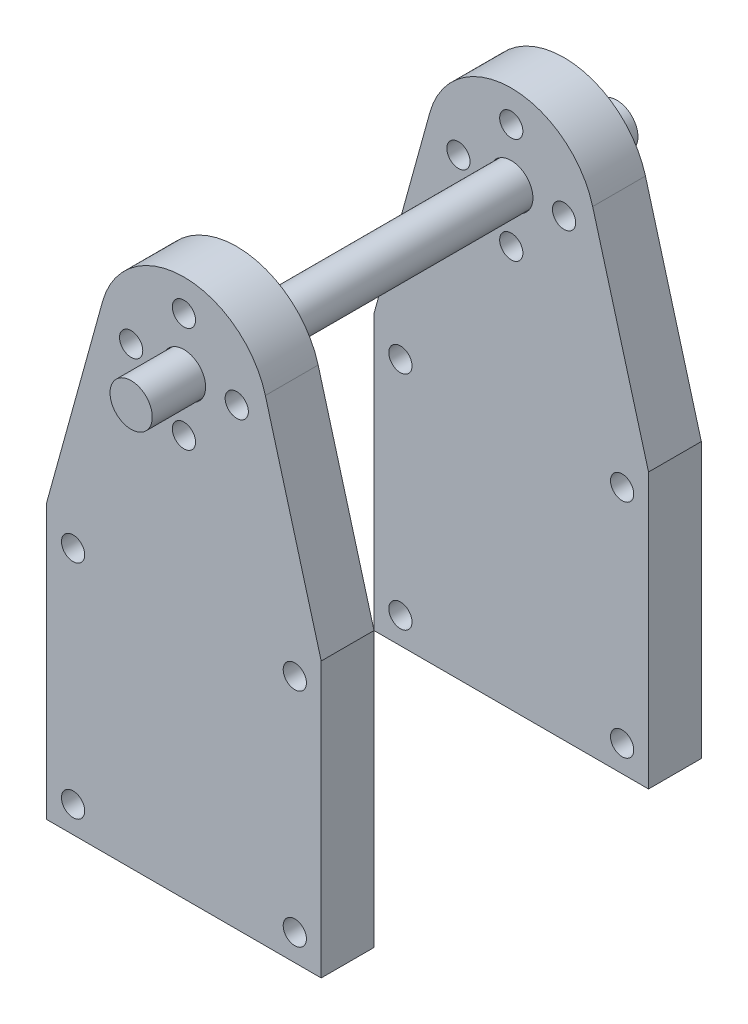
ISO-10303-21;
HEADER;
FILE_DESCRIPTION(('STEP AP214'),'2;1');
FILE_NAME('part.step','',(''),(''),'','','');
FILE_SCHEMA(('AUTOMOTIVE_DESIGN { 1 0 10303 214 1 1 1 1 }'));
ENDSEC;
DATA;
#1=APPLICATION_CONTEXT('core data for automotive mechanical design processes');
#2=APPLICATION_PROTOCOL_DEFINITION('international standard','automotive_design',2000,#1);
#3=PRODUCT_CONTEXT('',#1,'mechanical');
#4=PRODUCT('Part','Part','',(#3));
#5=PRODUCT_RELATED_PRODUCT_CATEGORY('part','',(#4));
#6=PRODUCT_DEFINITION_FORMATION('','',#4);
#7=PRODUCT_DEFINITION_CONTEXT('part definition',#1,'design');
#8=PRODUCT_DEFINITION('design','',#6,#7);
#9=PRODUCT_DEFINITION_SHAPE('','',#8);
#10=(LENGTH_UNIT() NAMED_UNIT(*) SI_UNIT(.MILLI.,.METRE.));
#11=(NAMED_UNIT(*) PLANE_ANGLE_UNIT() SI_UNIT($,.RADIAN.));
#12=(NAMED_UNIT(*) SI_UNIT($,.STERADIAN.) SOLID_ANGLE_UNIT());
#13=UNCERTAINTY_MEASURE_WITH_UNIT(LENGTH_MEASURE(1.E-05),#10,'distance_accuracy_value','');
#14=(GEOMETRIC_REPRESENTATION_CONTEXT(3) GLOBAL_UNCERTAINTY_ASSIGNED_CONTEXT((#13)) GLOBAL_UNIT_ASSIGNED_CONTEXT((#10,
#11,#12)) REPRESENTATION_CONTEXT('',''));
#15=CARTESIAN_POINT('',(0.,0.,0.));
#16=DIRECTION('',(0.,0.,1.));
#17=DIRECTION('',(1.,0.,0.));
#18=AXIS2_PLACEMENT_3D('',#15,#16,#17);
#19=CARTESIAN_POINT('',(0.,30.,-36.));
#20=DIRECTION('',(0.,0.,1.));
#21=DIRECTION('',(1.,0.,0.));
#22=AXIS2_PLACEMENT_3D('',#19,#20,#21);
#23=CYLINDRICAL_SURFACE('',#22,2.);
#24=CARTESIAN_POINT('',(0.,30.,-36.));
#25=DIRECTION('',(0.,0.,-1.));
#26=DIRECTION('',(-1.,0.,0.));
#27=AXIS2_PLACEMENT_3D('',#24,#25,#26);
#28=CIRCLE('',#27,2.);
#29=CARTESIAN_POINT('',(-2.,30.,-36.));
#30=VERTEX_POINT('',#29);
#31=EDGE_CURVE('E11',#30,#30,#28,.T.);
#32=ORIENTED_EDGE('',*,*,#31,.F.);
#33=EDGE_LOOP('',(#32));
#34=FACE_BOUND('',#33,.T.);
#35=CARTESIAN_POINT('',(0.,30.,10.));
#36=DIRECTION('',(0.,0.,-1.));
#37=DIRECTION('',(-1.,0.,0.));
#38=AXIS2_PLACEMENT_3D('',#35,#36,#37);
#39=CIRCLE('',#38,2.);
#40=CARTESIAN_POINT('',(-2.,30.,10.));
#41=VERTEX_POINT('',#40);
#42=EDGE_CURVE('E50',#41,#41,#39,.T.);
#43=ORIENTED_EDGE('',*,*,#42,.T.);
#44=EDGE_LOOP('',(#43));
#45=FACE_BOUND('',#44,.T.);
#46=ADVANCED_FACE('F44',(#34,#45),#23,.T.);
#47=CARTESIAN_POINT('',(0.,30.,-36.));
#48=DIRECTION('',(0.,0.,-1.));
#49=DIRECTION('',(-1.,0.,0.));
#50=AXIS2_PLACEMENT_3D('',#47,#48,#49);
#51=PLANE('',#50);
#52=ORIENTED_EDGE('',*,*,#31,.T.);
#53=EDGE_LOOP('',(#52));
#54=FACE_BOUND('',#53,.T.);
#55=ADVANCED_FACE('F59',(#54),#51,.T.);
#56=CARTESIAN_POINT('',(0.,30.,10.));
#57=DIRECTION('',(0.,0.,-1.));
#58=DIRECTION('',(-1.,0.,0.));
#59=AXIS2_PLACEMENT_3D('',#56,#57,#58);
#60=PLANE('',#59);
#61=ORIENTED_EDGE('',*,*,#42,.F.);
#62=EDGE_LOOP('',(#61));
#63=FACE_BOUND('',#62,.T.);
#64=ADVANCED_FACE('F57',(#63),#60,.F.);
#65=CLOSED_SHELL('',(#46,#55,#64));
#66=MANIFOLD_SOLID_BREP('B2',#65);
#67=CARTESIAN_POINT('',(-13.,-13.,-31.));
#68=DIRECTION('',(0.,-1.,0.));
#69=DIRECTION('',(0.,0.,-1.));
#70=AXIS2_PLACEMENT_3D('',#67,#68,#69);
#71=PLANE('',#70);
#72=DIRECTION('',(1.,0.,0.));
#73=VECTOR('',#72,1.);
#74=CARTESIAN_POINT('',(-13.,-13.,-26.));
#75=LINE('',#74,#73);
#76=CARTESIAN_POINT('',(-13.,-13.,-26.));
#77=VERTEX_POINT('',#76);
#78=CARTESIAN_POINT('',(13.,-13.,-26.));
#79=VERTEX_POINT('',#78);
#80=EDGE_CURVE('E179',#77,#79,#75,.T.);
#81=ORIENTED_EDGE('',*,*,#80,.F.);
#82=DIRECTION('',(0.,0.,1.));
#83=VECTOR('',#82,1.);
#84=CARTESIAN_POINT('',(-13.,-13.,-31.));
#85=LINE('',#84,#83);
#86=CARTESIAN_POINT('',(-13.,-13.,-31.));
#87=VERTEX_POINT('',#86);
#88=EDGE_CURVE('E42',#87,#77,#85,.T.);
#89=ORIENTED_EDGE('',*,*,#88,.F.);
#90=DIRECTION('',(1.,0.,0.));
#91=VECTOR('',#90,1.);
#92=CARTESIAN_POINT('',(-13.,-13.,-31.));
#93=LINE('',#92,#91);
#94=CARTESIAN_POINT('',(13.,-13.,-31.));
#95=VERTEX_POINT('',#94);
#96=EDGE_CURVE('E194',#87,#95,#93,.T.);
#97=ORIENTED_EDGE('',*,*,#96,.T.);
#98=DIRECTION('',(0.,0.,1.));
#99=VECTOR('',#98,1.);
#100=CARTESIAN_POINT('',(13.,-13.,-31.));
#101=LINE('',#100,#99);
#102=EDGE_CURVE('E97',#95,#79,#101,.T.);
#103=ORIENTED_EDGE('',*,*,#102,.T.);
#104=EDGE_LOOP('',(#81,#89,#97,#103));
#105=FACE_BOUND('',#104,.T.);
#106=ADVANCED_FACE('F94',(#105),#71,.T.);
#107=CARTESIAN_POINT('',(-13.,13.,-31.));
#108=DIRECTION('',(-1.,0.,0.));
#109=DIRECTION('',(0.,0.,1.));
#110=AXIS2_PLACEMENT_3D('',#107,#108,#109);
#111=PLANE('',#110);
#112=DIRECTION('',(0.,-1.,0.));
#113=VECTOR('',#112,1.);
#114=CARTESIAN_POINT('',(-13.,13.,-26.));
#115=LINE('',#114,#113);
#116=CARTESIAN_POINT('',(-13.,13.,-26.));
#117=VERTEX_POINT('',#116);
#118=EDGE_CURVE('E192',#117,#77,#115,.T.);
#119=ORIENTED_EDGE('',*,*,#118,.F.);
#120=DIRECTION('',(0.,0.,1.));
#121=VECTOR('',#120,1.);
#122=CARTESIAN_POINT('',(-13.,13.,-31.));
#123=LINE('',#122,#121);
#124=CARTESIAN_POINT('',(-13.,13.,-31.));
#125=VERTEX_POINT('',#124);
#126=EDGE_CURVE('E103',#125,#117,#123,.T.);
#127=ORIENTED_EDGE('',*,*,#126,.F.);
#128=DIRECTION('',(0.,-1.,0.));
#129=VECTOR('',#128,1.);
#130=CARTESIAN_POINT('',(-13.,13.,-31.));
#131=LINE('',#130,#129);
#132=EDGE_CURVE('E169',#125,#87,#131,.T.);
#133=ORIENTED_EDGE('',*,*,#132,.T.);
#134=ORIENTED_EDGE('',*,*,#88,.T.);
#135=EDGE_LOOP('',(#119,#127,#133,#134));
#136=FACE_BOUND('',#135,.T.);
#137=ADVANCED_FACE('F202',(#136),#111,.T.);
#138=CARTESIAN_POINT('',(-7.71074873540169,32.1317490329542,-31.));
#139=DIRECTION('',(-0.963843591925211,0.266468629119279,0.));
#140=DIRECTION('',(-0.266468629119279,-0.963843591925211,0.));
#141=AXIS2_PLACEMENT_3D('',#138,#139,#140);
#142=PLANE('',#141);
#143=DIRECTION('',(-0.266468629119279,-0.963843591925211,0.));
#144=VECTOR('',#143,1.);
#145=CARTESIAN_POINT('',(-7.71074873540169,32.1317490329542,-26.));
#146=LINE('',#145,#144);
#147=CARTESIAN_POINT('',(-7.71074873540169,32.1317490329542,-26.));
#148=VERTEX_POINT('',#147);
#149=EDGE_CURVE('E156',#148,#117,#146,.T.);
#150=ORIENTED_EDGE('',*,*,#149,.F.);
#151=DIRECTION('',(0.,0.,1.));
#152=VECTOR('',#151,1.);
#153=CARTESIAN_POINT('',(-7.71074873540169,32.1317490329542,-31.));
#154=LINE('',#153,#152);
#155=CARTESIAN_POINT('',(-7.71074873540169,32.1317490329542,-31.));
#156=VERTEX_POINT('',#155);
#157=EDGE_CURVE('E151',#156,#148,#154,.T.);
#158=ORIENTED_EDGE('',*,*,#157,.F.);
#159=DIRECTION('',(-0.266468629119279,-0.963843591925211,0.));
#160=VECTOR('',#159,1.);
#161=CARTESIAN_POINT('',(-7.71074873540169,32.1317490329542,-31.));
#162=LINE('',#161,#160);
#163=EDGE_CURVE('E154',#156,#125,#162,.T.);
#164=ORIENTED_EDGE('',*,*,#163,.T.);
#165=ORIENTED_EDGE('',*,*,#126,.T.);
#166=EDGE_LOOP('',(#150,#158,#164,#165));
#167=FACE_BOUND('',#166,.T.);
#168=ADVANCED_FACE('F153',(#167),#142,.T.);
#169=CARTESIAN_POINT('',(0.,30.,-31.));
#170=DIRECTION('',(0.,0.,1.));
#171=DIRECTION('',(1.,0.,0.));
#172=AXIS2_PLACEMENT_3D('',#169,#170,#171);
#173=CYLINDRICAL_SURFACE('',#172,8.);
#174=CARTESIAN_POINT('',(0.,30.,-26.));
#175=DIRECTION('',(0.,0.,1.));
#176=DIRECTION('',(1.,0.,0.));
#177=AXIS2_PLACEMENT_3D('',#174,#175,#176);
#178=CIRCLE('',#177,8.);
#179=CARTESIAN_POINT('',(7.71074873540169,32.1317490329542,-26.));
#180=VERTEX_POINT('',#179);
#181=EDGE_CURVE('E189',#180,#148,#178,.T.);
#182=ORIENTED_EDGE('',*,*,#181,.F.);
#183=DIRECTION('',(0.,0.,1.));
#184=VECTOR('',#183,1.);
#185=CARTESIAN_POINT('',(7.71074873540169,32.1317490329542,-31.));
#186=LINE('',#185,#184);
#187=CARTESIAN_POINT('',(7.71074873540169,32.1317490329542,-31.));
#188=VERTEX_POINT('',#187);
#189=EDGE_CURVE('E161',#188,#180,#186,.T.);
#190=ORIENTED_EDGE('',*,*,#189,.F.);
#191=CARTESIAN_POINT('',(0.,30.,-31.));
#192=DIRECTION('',(0.,0.,1.));
#193=DIRECTION('',(1.,0.,0.));
#194=AXIS2_PLACEMENT_3D('',#191,#192,#193);
#195=CIRCLE('',#194,8.);
#196=EDGE_CURVE('E167',#188,#156,#195,.T.);
#197=ORIENTED_EDGE('',*,*,#196,.T.);
#198=ORIENTED_EDGE('',*,*,#157,.T.);
#199=EDGE_LOOP('',(#182,#190,#197,#198));
#200=FACE_BOUND('',#199,.T.);
#201=ADVANCED_FACE('F171',(#200),#173,.T.);
#202=CARTESIAN_POINT('',(13.,13.,-31.));
#203=DIRECTION('',(0.963843591925211,0.266468629119279,0.));
#204=DIRECTION('',(-0.266468629119279,0.963843591925211,0.));
#205=AXIS2_PLACEMENT_3D('',#202,#203,#204);
#206=PLANE('',#205);
#207=DIRECTION('',(-0.266468629119279,0.963843591925211,0.));
#208=VECTOR('',#207,1.);
#209=CARTESIAN_POINT('',(13.,13.,-26.));
#210=LINE('',#209,#208);
#211=CARTESIAN_POINT('',(13.,13.,-26.));
#212=VERTEX_POINT('',#211);
#213=EDGE_CURVE('E186',#212,#180,#210,.T.);
#214=ORIENTED_EDGE('',*,*,#213,.F.);
#215=DIRECTION('',(0.,0.,1.));
#216=VECTOR('',#215,1.);
#217=CARTESIAN_POINT('',(13.,13.,-31.));
#218=LINE('',#217,#216);
#219=CARTESIAN_POINT('',(13.,13.,-31.));
#220=VERTEX_POINT('',#219);
#221=EDGE_CURVE('E197',#220,#212,#218,.T.);
#222=ORIENTED_EDGE('',*,*,#221,.F.);
#223=DIRECTION('',(-0.266468629119279,0.963843591925211,0.));
#224=VECTOR('',#223,1.);
#225=CARTESIAN_POINT('',(13.,13.,-31.));
#226=LINE('',#225,#224);
#227=EDGE_CURVE('E172',#220,#188,#226,.T.);
#228=ORIENTED_EDGE('',*,*,#227,.T.);
#229=ORIENTED_EDGE('',*,*,#189,.T.);
#230=EDGE_LOOP('',(#214,#222,#228,#229));
#231=FACE_BOUND('',#230,.T.);
#232=ADVANCED_FACE('F215',(#231),#206,.T.);
#233=CARTESIAN_POINT('',(13.,-13.,-31.));
#234=DIRECTION('',(1.,0.,0.));
#235=DIRECTION('',(0.,0.,-1.));
#236=AXIS2_PLACEMENT_3D('',#233,#234,#235);
#237=PLANE('',#236);
#238=DIRECTION('',(0.,1.,0.));
#239=VECTOR('',#238,1.);
#240=CARTESIAN_POINT('',(13.,-13.,-26.));
#241=LINE('',#240,#239);
#242=EDGE_CURVE('E182',#79,#212,#241,.T.);
#243=ORIENTED_EDGE('',*,*,#242,.F.);
#244=ORIENTED_EDGE('',*,*,#102,.F.);
#245=DIRECTION('',(0.,1.,0.));
#246=VECTOR('',#245,1.);
#247=CARTESIAN_POINT('',(13.,-13.,-31.));
#248=LINE('',#247,#246);
#249=EDGE_CURVE('E174',#95,#220,#248,.T.);
#250=ORIENTED_EDGE('',*,*,#249,.T.);
#251=ORIENTED_EDGE('',*,*,#221,.T.);
#252=EDGE_LOOP('',(#243,#244,#250,#251));
#253=FACE_BOUND('',#252,.T.);
#254=ADVANCED_FACE('F199',(#253),#237,.T.);
#255=CARTESIAN_POINT('',(0.,30.,-31.));
#256=DIRECTION('',(0.,0.,1.));
#257=DIRECTION('',(1.,0.,0.));
#258=AXIS2_PLACEMENT_3D('',#255,#256,#257);
#259=PLANE('',#258);
#260=CARTESIAN_POINT('',(-5.,30.,-31.));
#261=DIRECTION('',(0.,0.,1.));
#262=DIRECTION('',(1.,0.,0.));
#263=AXIS2_PLACEMENT_3D('',#260,#261,#262);
#264=CIRCLE('',#263,1.1);
#265=CARTESIAN_POINT('',(-3.9,30.,-31.));
#266=VERTEX_POINT('',#265);
#267=EDGE_CURVE('E269',#266,#266,#264,.T.);
#268=ORIENTED_EDGE('',*,*,#267,.T.);
#269=EDGE_LOOP('',(#268));
#270=FACE_BOUND('',#269,.T.);
#271=CARTESIAN_POINT('',(0.,25.,-31.));
#272=DIRECTION('',(0.,0.,1.));
#273=DIRECTION('',(1.,0.,0.));
#274=AXIS2_PLACEMENT_3D('',#271,#272,#273);
#275=CIRCLE('',#274,1.1);
#276=CARTESIAN_POINT('',(1.1,25.,-31.));
#277=VERTEX_POINT('',#276);
#278=EDGE_CURVE('E277',#277,#277,#275,.T.);
#279=ORIENTED_EDGE('',*,*,#278,.T.);
#280=EDGE_LOOP('',(#279));
#281=FACE_BOUND('',#280,.T.);
#282=CARTESIAN_POINT('',(5.,30.,-31.));
#283=DIRECTION('',(0.,0.,1.));
#284=DIRECTION('',(1.,0.,0.));
#285=AXIS2_PLACEMENT_3D('',#282,#283,#284);
#286=CIRCLE('',#285,1.1);
#287=CARTESIAN_POINT('',(6.1,30.,-31.));
#288=VERTEX_POINT('',#287);
#289=EDGE_CURVE('E283',#288,#288,#286,.T.);
#290=ORIENTED_EDGE('',*,*,#289,.T.);
#291=EDGE_LOOP('',(#290));
#292=FACE_BOUND('',#291,.T.);
#293=CARTESIAN_POINT('',(0.,35.,-31.));
#294=DIRECTION('',(0.,0.,1.));
#295=DIRECTION('',(1.,0.,0.));
#296=AXIS2_PLACEMENT_3D('',#293,#294,#295);
#297=CIRCLE('',#296,1.1);
#298=CARTESIAN_POINT('',(1.1,35.,-31.));
#299=VERTEX_POINT('',#298);
#300=EDGE_CURVE('E289',#299,#299,#297,.T.);
#301=ORIENTED_EDGE('',*,*,#300,.T.);
#302=EDGE_LOOP('',(#301));
#303=FACE_BOUND('',#302,.T.);
#304=CARTESIAN_POINT('',(0.,30.,-31.));
#305=DIRECTION('',(0.,0.,1.));
#306=DIRECTION('',(1.,0.,0.));
#307=AXIS2_PLACEMENT_3D('',#304,#305,#306);
#308=CIRCLE('',#307,2.05);
#309=CARTESIAN_POINT('',(2.05,30.,-31.));
#310=VERTEX_POINT('',#309);
#311=EDGE_CURVE('E295',#310,#310,#308,.T.);
#312=ORIENTED_EDGE('',*,*,#311,.T.);
#313=EDGE_LOOP('',(#312));
#314=FACE_BOUND('',#313,.T.);
#315=CARTESIAN_POINT('',(-10.5,-10.5,-31.));
#316=DIRECTION('',(0.,0.,1.));
#317=DIRECTION('',(1.,0.,0.));
#318=AXIS2_PLACEMENT_3D('',#315,#316,#317);
#319=CIRCLE('',#318,1.1);
#320=CARTESIAN_POINT('',(-9.4,-10.5,-31.));
#321=VERTEX_POINT('',#320);
#322=EDGE_CURVE('E301',#321,#321,#319,.T.);
#323=ORIENTED_EDGE('',*,*,#322,.T.);
#324=EDGE_LOOP('',(#323));
#325=FACE_BOUND('',#324,.T.);
#326=CARTESIAN_POINT('',(10.5,-10.5,-31.));
#327=DIRECTION('',(0.,0.,1.));
#328=DIRECTION('',(1.,0.,0.));
#329=AXIS2_PLACEMENT_3D('',#326,#327,#328);
#330=CIRCLE('',#329,1.1);
#331=CARTESIAN_POINT('',(11.6,-10.5,-31.));
#332=VERTEX_POINT('',#331);
#333=EDGE_CURVE('E307',#332,#332,#330,.T.);
#334=ORIENTED_EDGE('',*,*,#333,.T.);
#335=EDGE_LOOP('',(#334));
#336=FACE_BOUND('',#335,.T.);
#337=CARTESIAN_POINT('',(10.5,10.5,-31.));
#338=DIRECTION('',(0.,0.,1.));
#339=DIRECTION('',(1.,0.,0.));
#340=AXIS2_PLACEMENT_3D('',#337,#338,#339);
#341=CIRCLE('',#340,1.1);
#342=CARTESIAN_POINT('',(11.6,10.5,-31.));
#343=VERTEX_POINT('',#342);
#344=EDGE_CURVE('E313',#343,#343,#341,.T.);
#345=ORIENTED_EDGE('',*,*,#344,.T.);
#346=EDGE_LOOP('',(#345));
#347=FACE_BOUND('',#346,.T.);
#348=CARTESIAN_POINT('',(-10.5,10.5,-31.));
#349=DIRECTION('',(0.,0.,1.));
#350=DIRECTION('',(1.,0.,0.));
#351=AXIS2_PLACEMENT_3D('',#348,#349,#350);
#352=CIRCLE('',#351,1.1);
#353=CARTESIAN_POINT('',(-9.4,10.5,-31.));
#354=VERTEX_POINT('',#353);
#355=EDGE_CURVE('E183',#354,#354,#352,.T.);
#356=ORIENTED_EDGE('',*,*,#355,.T.);
#357=EDGE_LOOP('',(#356));
#358=FACE_BOUND('',#357,.T.);
#359=ORIENTED_EDGE('',*,*,#96,.F.);
#360=ORIENTED_EDGE('',*,*,#132,.F.);
#361=ORIENTED_EDGE('',*,*,#163,.F.);
#362=ORIENTED_EDGE('',*,*,#196,.F.);
#363=ORIENTED_EDGE('',*,*,#227,.F.);
#364=ORIENTED_EDGE('',*,*,#249,.F.);
#365=EDGE_LOOP('',(#359,#360,#361,#362,#363,#364));
#366=FACE_BOUND('',#365,.T.);
#367=ADVANCED_FACE('F165',(#270,#281,#292,#303,#314,#325,#336,#347,#358,#366),#259,.F.);
#368=CARTESIAN_POINT('',(0.,30.,-26.));
#369=DIRECTION('',(0.,0.,1.));
#370=DIRECTION('',(1.,0.,0.));
#371=AXIS2_PLACEMENT_3D('',#368,#369,#370);
#372=PLANE('',#371);
#373=CARTESIAN_POINT('',(-5.,30.,-26.));
#374=DIRECTION('',(0.,0.,1.));
#375=DIRECTION('',(1.,0.,0.));
#376=AXIS2_PLACEMENT_3D('',#373,#374,#375);
#377=CIRCLE('',#376,1.1);
#378=CARTESIAN_POINT('',(-3.9,30.,-26.));
#379=VERTEX_POINT('',#378);
#380=EDGE_CURVE('E272',#379,#379,#377,.T.);
#381=ORIENTED_EDGE('',*,*,#380,.F.);
#382=EDGE_LOOP('',(#381));
#383=FACE_BOUND('',#382,.T.);
#384=CARTESIAN_POINT('',(0.,25.,-26.));
#385=DIRECTION('',(0.,0.,1.));
#386=DIRECTION('',(1.,0.,0.));
#387=AXIS2_PLACEMENT_3D('',#384,#385,#386);
#388=CIRCLE('',#387,1.1);
#389=CARTESIAN_POINT('',(1.1,25.,-26.));
#390=VERTEX_POINT('',#389);
#391=EDGE_CURVE('E274',#390,#390,#388,.T.);
#392=ORIENTED_EDGE('',*,*,#391,.F.);
#393=EDGE_LOOP('',(#392));
#394=FACE_BOUND('',#393,.T.);
#395=CARTESIAN_POINT('',(5.,30.,-26.));
#396=DIRECTION('',(0.,0.,1.));
#397=DIRECTION('',(1.,0.,0.));
#398=AXIS2_PLACEMENT_3D('',#395,#396,#397);
#399=CIRCLE('',#398,1.1);
#400=CARTESIAN_POINT('',(6.1,30.,-26.));
#401=VERTEX_POINT('',#400);
#402=EDGE_CURVE('E280',#401,#401,#399,.T.);
#403=ORIENTED_EDGE('',*,*,#402,.F.);
#404=EDGE_LOOP('',(#403));
#405=FACE_BOUND('',#404,.T.);
#406=CARTESIAN_POINT('',(0.,35.,-26.));
#407=DIRECTION('',(0.,0.,1.));
#408=DIRECTION('',(1.,0.,0.));
#409=AXIS2_PLACEMENT_3D('',#406,#407,#408);
#410=CIRCLE('',#409,1.1);
#411=CARTESIAN_POINT('',(1.1,35.,-26.));
#412=VERTEX_POINT('',#411);
#413=EDGE_CURVE('E286',#412,#412,#410,.T.);
#414=ORIENTED_EDGE('',*,*,#413,.F.);
#415=EDGE_LOOP('',(#414));
#416=FACE_BOUND('',#415,.T.);
#417=CARTESIAN_POINT('',(0.,30.,-26.));
#418=DIRECTION('',(0.,0.,1.));
#419=DIRECTION('',(1.,0.,0.));
#420=AXIS2_PLACEMENT_3D('',#417,#418,#419);
#421=CIRCLE('',#420,2.05);
#422=CARTESIAN_POINT('',(2.05,30.,-26.));
#423=VERTEX_POINT('',#422);
#424=EDGE_CURVE('E292',#423,#423,#421,.T.);
#425=ORIENTED_EDGE('',*,*,#424,.F.);
#426=EDGE_LOOP('',(#425));
#427=FACE_BOUND('',#426,.T.);
#428=CARTESIAN_POINT('',(-10.5,-10.5,-26.));
#429=DIRECTION('',(0.,0.,1.));
#430=DIRECTION('',(1.,0.,0.));
#431=AXIS2_PLACEMENT_3D('',#428,#429,#430);
#432=CIRCLE('',#431,1.1);
#433=CARTESIAN_POINT('',(-9.4,-10.5,-26.));
#434=VERTEX_POINT('',#433);
#435=EDGE_CURVE('E298',#434,#434,#432,.T.);
#436=ORIENTED_EDGE('',*,*,#435,.F.);
#437=EDGE_LOOP('',(#436));
#438=FACE_BOUND('',#437,.T.);
#439=CARTESIAN_POINT('',(10.5,-10.5,-26.));
#440=DIRECTION('',(0.,0.,1.));
#441=DIRECTION('',(1.,0.,0.));
#442=AXIS2_PLACEMENT_3D('',#439,#440,#441);
#443=CIRCLE('',#442,1.1);
#444=CARTESIAN_POINT('',(11.6,-10.5,-26.));
#445=VERTEX_POINT('',#444);
#446=EDGE_CURVE('E304',#445,#445,#443,.T.);
#447=ORIENTED_EDGE('',*,*,#446,.F.);
#448=EDGE_LOOP('',(#447));
#449=FACE_BOUND('',#448,.T.);
#450=CARTESIAN_POINT('',(10.5,10.5,-26.));
#451=DIRECTION('',(0.,0.,1.));
#452=DIRECTION('',(1.,0.,0.));
#453=AXIS2_PLACEMENT_3D('',#450,#451,#452);
#454=CIRCLE('',#453,1.1);
#455=CARTESIAN_POINT('',(11.6,10.5,-26.));
#456=VERTEX_POINT('',#455);
#457=EDGE_CURVE('E310',#456,#456,#454,.T.);
#458=ORIENTED_EDGE('',*,*,#457,.F.);
#459=EDGE_LOOP('',(#458));
#460=FACE_BOUND('',#459,.T.);
#461=CARTESIAN_POINT('',(-10.5,10.5,-26.));
#462=DIRECTION('',(0.,0.,1.));
#463=DIRECTION('',(1.,0.,0.));
#464=AXIS2_PLACEMENT_3D('',#461,#462,#463);
#465=CIRCLE('',#464,1.1);
#466=CARTESIAN_POINT('',(-9.4,10.5,-26.));
#467=VERTEX_POINT('',#466);
#468=EDGE_CURVE('E316',#467,#467,#465,.T.);
#469=ORIENTED_EDGE('',*,*,#468,.F.);
#470=EDGE_LOOP('',(#469));
#471=FACE_BOUND('',#470,.T.);
#472=ORIENTED_EDGE('',*,*,#80,.T.);
#473=ORIENTED_EDGE('',*,*,#242,.T.);
#474=ORIENTED_EDGE('',*,*,#213,.T.);
#475=ORIENTED_EDGE('',*,*,#181,.T.);
#476=ORIENTED_EDGE('',*,*,#149,.T.);
#477=ORIENTED_EDGE('',*,*,#118,.T.);
#478=EDGE_LOOP('',(#472,#473,#474,#475,#476,#477));
#479=FACE_BOUND('',#478,.T.);
#480=ADVANCED_FACE('F201',(#383,#394,#405,#416,#427,#438,#449,#460,#471,#479),#372,.T.);
#481=CARTESIAN_POINT('',(-10.5,10.5,-31.));
#482=DIRECTION('',(0.,0.,1.));
#483=DIRECTION('',(1.,0.,0.));
#484=AXIS2_PLACEMENT_3D('',#481,#482,#483);
#485=CYLINDRICAL_SURFACE('',#484,1.1);
#486=ORIENTED_EDGE('',*,*,#355,.F.);
#487=EDGE_LOOP('',(#486));
#488=FACE_BOUND('',#487,.T.);
#489=ORIENTED_EDGE('',*,*,#468,.T.);
#490=EDGE_LOOP('',(#489));
#491=FACE_BOUND('',#490,.T.);
#492=ADVANCED_FACE('F226',(#488,#491),#485,.F.);
#493=CARTESIAN_POINT('',(10.5,10.5,-31.));
#494=DIRECTION('',(0.,0.,1.));
#495=DIRECTION('',(1.,0.,0.));
#496=AXIS2_PLACEMENT_3D('',#493,#494,#495);
#497=CYLINDRICAL_SURFACE('',#496,1.1);
#498=ORIENTED_EDGE('',*,*,#344,.F.);
#499=EDGE_LOOP('',(#498));
#500=FACE_BOUND('',#499,.T.);
#501=ORIENTED_EDGE('',*,*,#457,.T.);
#502=EDGE_LOOP('',(#501));
#503=FACE_BOUND('',#502,.T.);
#504=ADVANCED_FACE('F233',(#500,#503),#497,.F.);
#505=CARTESIAN_POINT('',(10.5,-10.5,-31.));
#506=DIRECTION('',(0.,0.,1.));
#507=DIRECTION('',(1.,0.,0.));
#508=AXIS2_PLACEMENT_3D('',#505,#506,#507);
#509=CYLINDRICAL_SURFACE('',#508,1.1);
#510=ORIENTED_EDGE('',*,*,#333,.F.);
#511=EDGE_LOOP('',(#510));
#512=FACE_BOUND('',#511,.T.);
#513=ORIENTED_EDGE('',*,*,#446,.T.);
#514=EDGE_LOOP('',(#513));
#515=FACE_BOUND('',#514,.T.);
#516=ADVANCED_FACE('F237',(#512,#515),#509,.F.);
#517=CARTESIAN_POINT('',(-10.5,-10.5,-31.));
#518=DIRECTION('',(0.,0.,1.));
#519=DIRECTION('',(1.,0.,0.));
#520=AXIS2_PLACEMENT_3D('',#517,#518,#519);
#521=CYLINDRICAL_SURFACE('',#520,1.1);
#522=ORIENTED_EDGE('',*,*,#322,.F.);
#523=EDGE_LOOP('',(#522));
#524=FACE_BOUND('',#523,.T.);
#525=ORIENTED_EDGE('',*,*,#435,.T.);
#526=EDGE_LOOP('',(#525));
#527=FACE_BOUND('',#526,.T.);
#528=ADVANCED_FACE('F241',(#524,#527),#521,.F.);
#529=CARTESIAN_POINT('',(0.,30.,-31.));
#530=DIRECTION('',(0.,0.,1.));
#531=DIRECTION('',(1.,0.,0.));
#532=AXIS2_PLACEMENT_3D('',#529,#530,#531);
#533=CYLINDRICAL_SURFACE('',#532,2.05);
#534=ORIENTED_EDGE('',*,*,#311,.F.);
#535=EDGE_LOOP('',(#534));
#536=FACE_BOUND('',#535,.T.);
#537=ORIENTED_EDGE('',*,*,#424,.T.);
#538=EDGE_LOOP('',(#537));
#539=FACE_BOUND('',#538,.T.);
#540=ADVANCED_FACE('F245',(#536,#539),#533,.F.);
#541=CARTESIAN_POINT('',(0.,35.,-31.));
#542=DIRECTION('',(0.,0.,1.));
#543=DIRECTION('',(1.,0.,0.));
#544=AXIS2_PLACEMENT_3D('',#541,#542,#543);
#545=CYLINDRICAL_SURFACE('',#544,1.1);
#546=ORIENTED_EDGE('',*,*,#300,.F.);
#547=EDGE_LOOP('',(#546));
#548=FACE_BOUND('',#547,.T.);
#549=ORIENTED_EDGE('',*,*,#413,.T.);
#550=EDGE_LOOP('',(#549));
#551=FACE_BOUND('',#550,.T.);
#552=ADVANCED_FACE('F249',(#548,#551),#545,.F.);
#553=CARTESIAN_POINT('',(5.,30.,-31.));
#554=DIRECTION('',(0.,0.,1.));
#555=DIRECTION('',(1.,0.,0.));
#556=AXIS2_PLACEMENT_3D('',#553,#554,#555);
#557=CYLINDRICAL_SURFACE('',#556,1.1);
#558=ORIENTED_EDGE('',*,*,#289,.F.);
#559=EDGE_LOOP('',(#558));
#560=FACE_BOUND('',#559,.T.);
#561=ORIENTED_EDGE('',*,*,#402,.T.);
#562=EDGE_LOOP('',(#561));
#563=FACE_BOUND('',#562,.T.);
#564=ADVANCED_FACE('F253',(#560,#563),#557,.F.);
#565=CARTESIAN_POINT('',(0.,25.,-31.));
#566=DIRECTION('',(0.,0.,1.));
#567=DIRECTION('',(1.,0.,0.));
#568=AXIS2_PLACEMENT_3D('',#565,#566,#567);
#569=CYLINDRICAL_SURFACE('',#568,1.1);
#570=ORIENTED_EDGE('',*,*,#278,.F.);
#571=EDGE_LOOP('',(#570));
#572=FACE_BOUND('',#571,.T.);
#573=ORIENTED_EDGE('',*,*,#391,.T.);
#574=EDGE_LOOP('',(#573));
#575=FACE_BOUND('',#574,.T.);
#576=ADVANCED_FACE('F257',(#572,#575),#569,.F.);
#577=CARTESIAN_POINT('',(-5.,30.,-31.));
#578=DIRECTION('',(0.,0.,1.));
#579=DIRECTION('',(1.,0.,0.));
#580=AXIS2_PLACEMENT_3D('',#577,#578,#579);
#581=CYLINDRICAL_SURFACE('',#580,1.1);
#582=ORIENTED_EDGE('',*,*,#267,.F.);
#583=EDGE_LOOP('',(#582));
#584=FACE_BOUND('',#583,.T.);
#585=ORIENTED_EDGE('',*,*,#380,.T.);
#586=EDGE_LOOP('',(#585));
#587=FACE_BOUND('',#586,.T.);
#588=ADVANCED_FACE('F261',(#584,#587),#581,.F.);
#589=CLOSED_SHELL('',(#106,#137,#168,#201,#232,#254,#367,#480,#492,#504,#516,#528,#540,#552,
#564,#576,#588));
#590=MANIFOLD_SOLID_BREP('B6',#589);
#591=CARTESIAN_POINT('',(0.,30.,5.));
#592=DIRECTION('',(0.,0.,1.));
#593=DIRECTION('',(1.,0.,0.));
#594=AXIS2_PLACEMENT_3D('',#591,#592,#593);
#595=PLANE('',#594);
#596=CARTESIAN_POINT('',(0.,25.,5.));
#597=DIRECTION('',(0.,0.,1.));
#598=DIRECTION('',(1.,0.,0.));
#599=AXIS2_PLACEMENT_3D('',#596,#597,#598);
#600=CIRCLE('',#599,1.1);
#601=CARTESIAN_POINT('',(1.1,25.,5.));
#602=VERTEX_POINT('',#601);
#603=EDGE_CURVE('E635',#602,#602,#600,.T.);
#604=ORIENTED_EDGE('',*,*,#603,.F.);
#605=EDGE_LOOP('',(#604));
#606=FACE_BOUND('',#605,.T.);
#607=CARTESIAN_POINT('',(0.,35.,5.));
#608=DIRECTION('',(0.,0.,1.));
#609=DIRECTION('',(1.,0.,0.));
#610=AXIS2_PLACEMENT_3D('',#607,#608,#609);
#611=CIRCLE('',#610,1.1);
#612=CARTESIAN_POINT('',(1.1,35.,5.));
#613=VERTEX_POINT('',#612);
#614=EDGE_CURVE('E647',#613,#613,#611,.T.);
#615=ORIENTED_EDGE('',*,*,#614,.F.);
#616=EDGE_LOOP('',(#615));
#617=FACE_BOUND('',#616,.T.);
#618=CARTESIAN_POINT('',(-10.5,-10.5,5.));
#619=DIRECTION('',(0.,0.,1.));
#620=DIRECTION('',(1.,0.,0.));
#621=AXIS2_PLACEMENT_3D('',#618,#619,#620);
#622=CIRCLE('',#621,1.1);
#623=CARTESIAN_POINT('',(-9.4,-10.5,5.));
#624=VERTEX_POINT('',#623);
#625=EDGE_CURVE('E659',#624,#624,#622,.T.);
#626=ORIENTED_EDGE('',*,*,#625,.F.);
#627=EDGE_LOOP('',(#626));
#628=FACE_BOUND('',#627,.T.);
#629=CARTESIAN_POINT('',(10.5,10.5,5.));
#630=DIRECTION('',(0.,0.,1.));
#631=DIRECTION('',(1.,0.,0.));
#632=AXIS2_PLACEMENT_3D('',#629,#630,#631);
#633=CIRCLE('',#632,1.1);
#634=CARTESIAN_POINT('',(11.6,10.5,5.));
#635=VERTEX_POINT('',#634);
#636=EDGE_CURVE('E671',#635,#635,#633,.T.);
#637=ORIENTED_EDGE('',*,*,#636,.F.);
#638=EDGE_LOOP('',(#637));
#639=FACE_BOUND('',#638,.T.);
#640=DIRECTION('',(0.,-1.,0.));
#641=VECTOR('',#640,1.);
#642=CARTESIAN_POINT('',(-13.,-13.,5.));
#643=LINE('',#642,#641);
#644=CARTESIAN_POINT('',(-13.,13.,5.));
#645=VERTEX_POINT('',#644);
#646=CARTESIAN_POINT('',(-13.,-13.,5.));
#647=VERTEX_POINT('',#646);
#648=EDGE_CURVE('E555',#645,#647,#643,.T.);
#649=ORIENTED_EDGE('',*,*,#648,.T.);
#650=DIRECTION('',(1.,0.,0.));
#651=VECTOR('',#650,1.);
#652=CARTESIAN_POINT('',(-13.,-13.,5.));
#653=LINE('',#652,#651);
#654=CARTESIAN_POINT('',(13.,-13.,5.));
#655=VERTEX_POINT('',#654);
#656=EDGE_CURVE('E513',#647,#655,#653,.T.);
#657=ORIENTED_EDGE('',*,*,#656,.T.);
#658=DIRECTION('',(0.,1.,0.));
#659=VECTOR('',#658,1.);
#660=CARTESIAN_POINT('',(13.,-13.,5.));
#661=LINE('',#660,#659);
#662=CARTESIAN_POINT('',(13.,13.,5.));
#663=VERTEX_POINT('',#662);
#664=EDGE_CURVE('E526',#655,#663,#661,.T.);
#665=ORIENTED_EDGE('',*,*,#664,.T.);
#666=DIRECTION('',(-0.266468629119279,0.963843591925211,0.));
#667=VECTOR('',#666,1.);
#668=CARTESIAN_POINT('',(7.71074873540169,32.1317490329542,5.));
#669=LINE('',#668,#667);
#670=CARTESIAN_POINT('',(7.71074873540169,32.1317490329542,5.));
#671=VERTEX_POINT('',#670);
#672=EDGE_CURVE('E520',#663,#671,#669,.T.);
#673=ORIENTED_EDGE('',*,*,#672,.T.);
#674=CARTESIAN_POINT('',(0.,30.,5.));
#675=DIRECTION('',(0.,0.,1.));
#676=DIRECTION('',(1.,0.,0.));
#677=AXIS2_PLACEMENT_3D('',#674,#675,#676);
#678=CIRCLE('',#677,8.);
#679=CARTESIAN_POINT('',(-7.71074873540169,32.1317490329542,5.));
#680=VERTEX_POINT('',#679);
#681=EDGE_CURVE('E524',#671,#680,#678,.T.);
#682=ORIENTED_EDGE('',*,*,#681,.T.);
#683=DIRECTION('',(-0.266468629119279,-0.963843591925211,0.));
#684=VECTOR('',#683,1.);
#685=CARTESIAN_POINT('',(-13.,13.,5.));
#686=LINE('',#685,#684);
#687=EDGE_CURVE('E476',#680,#645,#686,.T.);
#688=ORIENTED_EDGE('',*,*,#687,.T.);
#689=EDGE_LOOP('',(#649,#657,#665,#673,#682,#688));
#690=FACE_BOUND('',#689,.T.);
#691=CARTESIAN_POINT('',(-10.5,10.5,5.));
#692=DIRECTION('',(0.,0.,1.));
#693=DIRECTION('',(1.,0.,0.));
#694=AXIS2_PLACEMENT_3D('',#691,#692,#693);
#695=CIRCLE('',#694,1.1);
#696=CARTESIAN_POINT('',(-9.4,10.5,5.));
#697=VERTEX_POINT('',#696);
#698=EDGE_CURVE('E548',#697,#697,#695,.T.);
#699=ORIENTED_EDGE('',*,*,#698,.F.);
#700=EDGE_LOOP('',(#699));
#701=FACE_BOUND('',#700,.T.);
#702=CARTESIAN_POINT('',(10.5,-10.5,5.));
#703=DIRECTION('',(0.,0.,1.));
#704=DIRECTION('',(1.,0.,0.));
#705=AXIS2_PLACEMENT_3D('',#702,#703,#704);
#706=CIRCLE('',#705,1.1);
#707=CARTESIAN_POINT('',(11.6,-10.5,5.));
#708=VERTEX_POINT('',#707);
#709=EDGE_CURVE('E665',#708,#708,#706,.T.);
#710=ORIENTED_EDGE('',*,*,#709,.F.);
#711=EDGE_LOOP('',(#710));
#712=FACE_BOUND('',#711,.T.);
#713=CARTESIAN_POINT('',(0.,30.,5.));
#714=DIRECTION('',(0.,0.,1.));
#715=DIRECTION('',(1.,0.,0.));
#716=AXIS2_PLACEMENT_3D('',#713,#714,#715);
#717=CIRCLE('',#716,2.05);
#718=CARTESIAN_POINT('',(2.05,30.,5.));
#719=VERTEX_POINT('',#718);
#720=EDGE_CURVE('E653',#719,#719,#717,.T.);
#721=ORIENTED_EDGE('',*,*,#720,.F.);
#722=EDGE_LOOP('',(#721));
#723=FACE_BOUND('',#722,.T.);
#724=CARTESIAN_POINT('',(5.,30.,5.));
#725=DIRECTION('',(0.,0.,1.));
#726=DIRECTION('',(1.,0.,0.));
#727=AXIS2_PLACEMENT_3D('',#724,#725,#726);
#728=CIRCLE('',#727,1.1);
#729=CARTESIAN_POINT('',(6.1,30.,5.));
#730=VERTEX_POINT('',#729);
#731=EDGE_CURVE('E641',#730,#730,#728,.T.);
#732=ORIENTED_EDGE('',*,*,#731,.F.);
#733=EDGE_LOOP('',(#732));
#734=FACE_BOUND('',#733,.T.);
#735=CARTESIAN_POINT('',(-5.,30.,5.));
#736=DIRECTION('',(0.,0.,1.));
#737=DIRECTION('',(1.,0.,0.));
#738=AXIS2_PLACEMENT_3D('',#735,#736,#737);
#739=CIRCLE('',#738,1.1);
#740=CARTESIAN_POINT('',(-3.9,30.,5.));
#741=VERTEX_POINT('',#740);
#742=EDGE_CURVE('E626',#741,#741,#739,.T.);
#743=ORIENTED_EDGE('',*,*,#742,.F.);
#744=EDGE_LOOP('',(#743));
#745=FACE_BOUND('',#744,.T.);
#746=ADVANCED_FACE('F459',(#606,#617,#628,#639,#690,#701,#712,#723,#734,#745),#595,.T.);
#747=CARTESIAN_POINT('',(0.,30.,0.));
#748=DIRECTION('',(0.,0.,1.));
#749=DIRECTION('',(1.,0.,0.));
#750=AXIS2_PLACEMENT_3D('',#747,#748,#749);
#751=PLANE('',#750);
#752=DIRECTION('',(0.,-1.,0.));
#753=VECTOR('',#752,1.);
#754=CARTESIAN_POINT('',(-13.,-13.,0.));
#755=LINE('',#754,#753);
#756=CARTESIAN_POINT('',(-13.,13.,0.));
#757=VERTEX_POINT('',#756);
#758=CARTESIAN_POINT('',(-13.,-13.,0.));
#759=VERTEX_POINT('',#758);
#760=EDGE_CURVE('E544',#757,#759,#755,.T.);
#761=ORIENTED_EDGE('',*,*,#760,.F.);
#762=DIRECTION('',(-0.266468629119279,-0.963843591925211,0.));
#763=VECTOR('',#762,1.);
#764=CARTESIAN_POINT('',(-13.,13.,0.));
#765=LINE('',#764,#763);
#766=CARTESIAN_POINT('',(-7.71074873540169,32.1317490329542,0.));
#767=VERTEX_POINT('',#766);
#768=EDGE_CURVE('E505',#767,#757,#765,.T.);
#769=ORIENTED_EDGE('',*,*,#768,.F.);
#770=CARTESIAN_POINT('',(0.,30.,0.));
#771=DIRECTION('',(0.,0.,1.));
#772=DIRECTION('',(1.,0.,0.));
#773=AXIS2_PLACEMENT_3D('',#770,#771,#772);
#774=CIRCLE('',#773,8.);
#775=CARTESIAN_POINT('',(7.71074873540169,32.1317490329542,0.));
#776=VERTEX_POINT('',#775);
#777=EDGE_CURVE('E499',#776,#767,#774,.T.);
#778=ORIENTED_EDGE('',*,*,#777,.F.);
#779=DIRECTION('',(-0.266468629119279,0.963843591925211,0.));
#780=VECTOR('',#779,1.);
#781=CARTESIAN_POINT('',(7.71074873540169,32.1317490329542,0.));
#782=LINE('',#781,#780);
#783=CARTESIAN_POINT('',(13.,13.,0.));
#784=VERTEX_POINT('',#783);
#785=EDGE_CURVE('E534',#784,#776,#782,.T.);
#786=ORIENTED_EDGE('',*,*,#785,.F.);
#787=DIRECTION('',(0.,1.,0.));
#788=VECTOR('',#787,1.);
#789=CARTESIAN_POINT('',(13.,-13.,0.));
#790=LINE('',#789,#788);
#791=CARTESIAN_POINT('',(13.,-13.,0.));
#792=VERTEX_POINT('',#791);
#793=EDGE_CURVE('E550',#792,#784,#790,.T.);
#794=ORIENTED_EDGE('',*,*,#793,.F.);
#795=DIRECTION('',(1.,0.,0.));
#796=VECTOR('',#795,1.);
#797=CARTESIAN_POINT('',(-13.,-13.,0.));
#798=LINE('',#797,#796);
#799=EDGE_CURVE('E547',#759,#792,#798,.T.);
#800=ORIENTED_EDGE('',*,*,#799,.F.);
#801=EDGE_LOOP('',(#761,#769,#778,#786,#794,#800));
#802=FACE_BOUND('',#801,.T.);
#803=CARTESIAN_POINT('',(-10.5,10.5,0.));
#804=DIRECTION('',(0.,0.,1.));
#805=DIRECTION('',(1.,0.,0.));
#806=AXIS2_PLACEMENT_3D('',#803,#804,#805);
#807=CIRCLE('',#806,1.1);
#808=CARTESIAN_POINT('',(-9.4,10.5,0.));
#809=VERTEX_POINT('',#808);
#810=EDGE_CURVE('E674',#809,#809,#807,.T.);
#811=ORIENTED_EDGE('',*,*,#810,.T.);
#812=EDGE_LOOP('',(#811));
#813=FACE_BOUND('',#812,.T.);
#814=CARTESIAN_POINT('',(10.5,10.5,0.));
#815=DIRECTION('',(0.,0.,1.));
#816=DIRECTION('',(1.,0.,0.));
#817=AXIS2_PLACEMENT_3D('',#814,#815,#816);
#818=CIRCLE('',#817,1.1);
#819=CARTESIAN_POINT('',(11.6,10.5,0.));
#820=VERTEX_POINT('',#819);
#821=EDGE_CURVE('E668',#820,#820,#818,.T.);
#822=ORIENTED_EDGE('',*,*,#821,.T.);
#823=EDGE_LOOP('',(#822));
#824=FACE_BOUND('',#823,.T.);
#825=CARTESIAN_POINT('',(10.5,-10.5,0.));
#826=DIRECTION('',(0.,0.,1.));
#827=DIRECTION('',(1.,0.,0.));
#828=AXIS2_PLACEMENT_3D('',#825,#826,#827);
#829=CIRCLE('',#828,1.1);
#830=CARTESIAN_POINT('',(11.6,-10.5,0.));
#831=VERTEX_POINT('',#830);
#832=EDGE_CURVE('E662',#831,#831,#829,.T.);
#833=ORIENTED_EDGE('',*,*,#832,.T.);
#834=EDGE_LOOP('',(#833));
#835=FACE_BOUND('',#834,.T.);
#836=CARTESIAN_POINT('',(-10.5,-10.5,0.));
#837=DIRECTION('',(0.,0.,1.));
#838=DIRECTION('',(1.,0.,0.));
#839=AXIS2_PLACEMENT_3D('',#836,#837,#838);
#840=CIRCLE('',#839,1.1);
#841=CARTESIAN_POINT('',(-9.4,-10.5,0.));
#842=VERTEX_POINT('',#841);
#843=EDGE_CURVE('E656',#842,#842,#840,.T.);
#844=ORIENTED_EDGE('',*,*,#843,.T.);
#845=EDGE_LOOP('',(#844));
#846=FACE_BOUND('',#845,.T.);
#847=CARTESIAN_POINT('',(0.,30.,0.));
#848=DIRECTION('',(0.,0.,1.));
#849=DIRECTION('',(1.,0.,0.));
#850=AXIS2_PLACEMENT_3D('',#847,#848,#849);
#851=CIRCLE('',#850,2.05);
#852=CARTESIAN_POINT('',(2.05,30.,0.));
#853=VERTEX_POINT('',#852);
#854=EDGE_CURVE('E650',#853,#853,#851,.T.);
#855=ORIENTED_EDGE('',*,*,#854,.T.);
#856=EDGE_LOOP('',(#855));
#857=FACE_BOUND('',#856,.T.);
#858=CARTESIAN_POINT('',(0.,35.,0.));
#859=DIRECTION('',(0.,0.,1.));
#860=DIRECTION('',(1.,0.,0.));
#861=AXIS2_PLACEMENT_3D('',#858,#859,#860);
#862=CIRCLE('',#861,1.1);
#863=CARTESIAN_POINT('',(1.1,35.,0.));
#864=VERTEX_POINT('',#863);
#865=EDGE_CURVE('E644',#864,#864,#862,.T.);
#866=ORIENTED_EDGE('',*,*,#865,.T.);
#867=EDGE_LOOP('',(#866));
#868=FACE_BOUND('',#867,.T.);
#869=CARTESIAN_POINT('',(5.,30.,0.));
#870=DIRECTION('',(0.,0.,1.));
#871=DIRECTION('',(1.,0.,0.));
#872=AXIS2_PLACEMENT_3D('',#869,#870,#871);
#873=CIRCLE('',#872,1.1);
#874=CARTESIAN_POINT('',(6.1,30.,0.));
#875=VERTEX_POINT('',#874);
#876=EDGE_CURVE('E638',#875,#875,#873,.T.);
#877=ORIENTED_EDGE('',*,*,#876,.T.);
#878=EDGE_LOOP('',(#877));
#879=FACE_BOUND('',#878,.T.);
#880=CARTESIAN_POINT('',(0.,25.,0.));
#881=DIRECTION('',(0.,0.,1.));
#882=DIRECTION('',(1.,0.,0.));
#883=AXIS2_PLACEMENT_3D('',#880,#881,#882);
#884=CIRCLE('',#883,1.1);
#885=CARTESIAN_POINT('',(1.1,25.,0.));
#886=VERTEX_POINT('',#885);
#887=EDGE_CURVE('E632',#886,#886,#884,.T.);
#888=ORIENTED_EDGE('',*,*,#887,.T.);
#889=EDGE_LOOP('',(#888));
#890=FACE_BOUND('',#889,.T.);
#891=CARTESIAN_POINT('',(-5.,30.,0.));
#892=DIRECTION('',(0.,0.,1.));
#893=DIRECTION('',(1.,0.,0.));
#894=AXIS2_PLACEMENT_3D('',#891,#892,#893);
#895=CIRCLE('',#894,1.1);
#896=CARTESIAN_POINT('',(-3.9,30.,0.));
#897=VERTEX_POINT('',#896);
#898=EDGE_CURVE('E629',#897,#897,#895,.T.);
#899=ORIENTED_EDGE('',*,*,#898,.T.);
#900=EDGE_LOOP('',(#899));
#901=FACE_BOUND('',#900,.T.);
#902=ADVANCED_FACE('F564',(#802,#813,#824,#835,#846,#857,#868,#879,#890,#901),#751,.F.);
#903=CARTESIAN_POINT('',(-13.,-13.,5.));
#904=DIRECTION('',(1.,0.,0.));
#905=DIRECTION('',(0.,0.,-1.));
#906=AXIS2_PLACEMENT_3D('',#903,#904,#905);
#907=PLANE('',#906);
#908=ORIENTED_EDGE('',*,*,#760,.T.);
#909=DIRECTION('',(0.,0.,-1.));
#910=VECTOR('',#909,1.);
#911=CARTESIAN_POINT('',(-13.,-13.,5.));
#912=LINE('',#911,#910);
#913=EDGE_CURVE('E92',#647,#759,#912,.T.);
#914=ORIENTED_EDGE('',*,*,#913,.F.);
#915=ORIENTED_EDGE('',*,*,#648,.F.);
#916=DIRECTION('',(0.,0.,-1.));
#917=VECTOR('',#916,1.);
#918=CARTESIAN_POINT('',(-13.,13.,5.));
#919=LINE('',#918,#917);
#920=EDGE_CURVE('E540',#645,#757,#919,.T.);
#921=ORIENTED_EDGE('',*,*,#920,.T.);
#922=EDGE_LOOP('',(#908,#914,#915,#921));
#923=FACE_BOUND('',#922,.T.);
#924=ADVANCED_FACE('F461',(#923),#907,.F.);
#925=CARTESIAN_POINT('',(-13.,-13.,5.));
#926=DIRECTION('',(0.,1.,0.));
#927=DIRECTION('',(0.,0.,1.));
#928=AXIS2_PLACEMENT_3D('',#925,#926,#927);
#929=PLANE('',#928);
#930=ORIENTED_EDGE('',*,*,#799,.T.);
#931=DIRECTION('',(0.,0.,-1.));
#932=VECTOR('',#931,1.);
#933=CARTESIAN_POINT('',(13.,-13.,5.));
#934=LINE('',#933,#932);
#935=EDGE_CURVE('E468',#655,#792,#934,.T.);
#936=ORIENTED_EDGE('',*,*,#935,.F.);
#937=ORIENTED_EDGE('',*,*,#656,.F.);
#938=ORIENTED_EDGE('',*,*,#913,.T.);
#939=EDGE_LOOP('',(#930,#936,#937,#938));
#940=FACE_BOUND('',#939,.T.);
#941=ADVANCED_FACE('F777',(#940),#929,.F.);
#942=CARTESIAN_POINT('',(13.,-13.,5.));
#943=DIRECTION('',(-1.,0.,0.));
#944=DIRECTION('',(0.,0.,1.));
#945=AXIS2_PLACEMENT_3D('',#942,#943,#944);
#946=PLANE('',#945);
#947=ORIENTED_EDGE('',*,*,#793,.T.);
#948=DIRECTION('',(0.,0.,-1.));
#949=VECTOR('',#948,1.);
#950=CARTESIAN_POINT('',(13.,13.,5.));
#951=LINE('',#950,#949);
#952=EDGE_CURVE('E535',#663,#784,#951,.T.);
#953=ORIENTED_EDGE('',*,*,#952,.F.);
#954=ORIENTED_EDGE('',*,*,#664,.F.);
#955=ORIENTED_EDGE('',*,*,#935,.T.);
#956=EDGE_LOOP('',(#947,#953,#954,#955));
#957=FACE_BOUND('',#956,.T.);
#958=ADVANCED_FACE('F561',(#957),#946,.F.);
#959=CARTESIAN_POINT('',(7.71074873540169,32.1317490329542,5.));
#960=DIRECTION('',(-0.963843591925211,-0.266468629119279,0.));
#961=DIRECTION('',(0.266468629119279,-0.963843591925211,0.));
#962=AXIS2_PLACEMENT_3D('',#959,#960,#961);
#963=PLANE('',#962);
#964=ORIENTED_EDGE('',*,*,#785,.T.);
#965=DIRECTION('',(0.,0.,-1.));
#966=VECTOR('',#965,1.);
#967=CARTESIAN_POINT('',(7.71074873540169,32.1317490329542,5.));
#968=LINE('',#967,#966);
#969=EDGE_CURVE('E531',#671,#776,#968,.T.);
#970=ORIENTED_EDGE('',*,*,#969,.F.);
#971=ORIENTED_EDGE('',*,*,#672,.F.);
#972=ORIENTED_EDGE('',*,*,#952,.T.);
#973=EDGE_LOOP('',(#964,#970,#971,#972));
#974=FACE_BOUND('',#973,.T.);
#975=ADVANCED_FACE('F532',(#974),#963,.F.);
#976=CARTESIAN_POINT('',(0.,30.,5.));
#977=DIRECTION('',(0.,0.,-1.));
#978=DIRECTION('',(-1.,0.,0.));
#979=AXIS2_PLACEMENT_3D('',#976,#977,#978);
#980=CYLINDRICAL_SURFACE('',#979,8.);
#981=ORIENTED_EDGE('',*,*,#777,.T.);
#982=DIRECTION('',(0.,0.,-1.));
#983=VECTOR('',#982,1.);
#984=CARTESIAN_POINT('',(-7.71074873540169,32.1317490329542,5.));
#985=LINE('',#984,#983);
#986=EDGE_CURVE('E536',#680,#767,#985,.T.);
#987=ORIENTED_EDGE('',*,*,#986,.F.);
#988=ORIENTED_EDGE('',*,*,#681,.F.);
#989=ORIENTED_EDGE('',*,*,#969,.T.);
#990=EDGE_LOOP('',(#981,#987,#988,#989));
#991=FACE_BOUND('',#990,.T.);
#992=ADVANCED_FACE('F538',(#991),#980,.T.);
#993=CARTESIAN_POINT('',(-13.,13.,5.));
#994=DIRECTION('',(0.963843591925211,-0.266468629119279,0.));
#995=DIRECTION('',(0.266468629119279,0.963843591925211,0.));
#996=AXIS2_PLACEMENT_3D('',#993,#994,#995);
#997=PLANE('',#996);
#998=ORIENTED_EDGE('',*,*,#768,.T.);
#999=ORIENTED_EDGE('',*,*,#920,.F.);
#1000=ORIENTED_EDGE('',*,*,#687,.F.);
#1001=ORIENTED_EDGE('',*,*,#986,.T.);
#1002=EDGE_LOOP('',(#998,#999,#1000,#1001));
#1003=FACE_BOUND('',#1002,.T.);
#1004=ADVANCED_FACE('F569',(#1003),#997,.F.);
#1005=CARTESIAN_POINT('',(-10.5,10.5,5.));
#1006=DIRECTION('',(0.,0.,-1.));
#1007=DIRECTION('',(-1.,0.,0.));
#1008=AXIS2_PLACEMENT_3D('',#1005,#1006,#1007);
#1009=CYLINDRICAL_SURFACE('',#1008,1.1);
#1010=ORIENTED_EDGE('',*,*,#698,.T.);
#1011=EDGE_LOOP('',(#1010));
#1012=FACE_BOUND('',#1011,.T.);
#1013=ORIENTED_EDGE('',*,*,#810,.F.);
#1014=EDGE_LOOP('',(#1013));
#1015=FACE_BOUND('',#1014,.T.);
#1016=ADVANCED_FACE('F571',(#1012,#1015),#1009,.F.);
#1017=CARTESIAN_POINT('',(10.5,10.5,5.));
#1018=DIRECTION('',(0.,0.,-1.));
#1019=DIRECTION('',(-1.,0.,0.));
#1020=AXIS2_PLACEMENT_3D('',#1017,#1018,#1019);
#1021=CYLINDRICAL_SURFACE('',#1020,1.1);
#1022=ORIENTED_EDGE('',*,*,#636,.T.);
#1023=EDGE_LOOP('',(#1022));
#1024=FACE_BOUND('',#1023,.T.);
#1025=ORIENTED_EDGE('',*,*,#821,.F.);
#1026=EDGE_LOOP('',(#1025));
#1027=FACE_BOUND('',#1026,.T.);
#1028=ADVANCED_FACE('F577',(#1024,#1027),#1021,.F.);
#1029=CARTESIAN_POINT('',(10.5,-10.5,5.));
#1030=DIRECTION('',(0.,0.,-1.));
#1031=DIRECTION('',(-1.,0.,0.));
#1032=AXIS2_PLACEMENT_3D('',#1029,#1030,#1031);
#1033=CYLINDRICAL_SURFACE('',#1032,1.1);
#1034=ORIENTED_EDGE('',*,*,#709,.T.);
#1035=EDGE_LOOP('',(#1034));
#1036=FACE_BOUND('',#1035,.T.);
#1037=ORIENTED_EDGE('',*,*,#832,.F.);
#1038=EDGE_LOOP('',(#1037));
#1039=FACE_BOUND('',#1038,.T.);
#1040=ADVANCED_FACE('F593',(#1036,#1039),#1033,.F.);
#1041=CARTESIAN_POINT('',(-10.5,-10.5,5.));
#1042=DIRECTION('',(0.,0.,-1.));
#1043=DIRECTION('',(-1.,0.,0.));
#1044=AXIS2_PLACEMENT_3D('',#1041,#1042,#1043);
#1045=CYLINDRICAL_SURFACE('',#1044,1.1);
#1046=ORIENTED_EDGE('',*,*,#625,.T.);
#1047=EDGE_LOOP('',(#1046));
#1048=FACE_BOUND('',#1047,.T.);
#1049=ORIENTED_EDGE('',*,*,#843,.F.);
#1050=EDGE_LOOP('',(#1049));
#1051=FACE_BOUND('',#1050,.T.);
#1052=ADVANCED_FACE('F597',(#1048,#1051),#1045,.F.);
#1053=CARTESIAN_POINT('',(0.,30.,5.));
#1054=DIRECTION('',(0.,0.,-1.));
#1055=DIRECTION('',(-1.,0.,0.));
#1056=AXIS2_PLACEMENT_3D('',#1053,#1054,#1055);
#1057=CYLINDRICAL_SURFACE('',#1056,2.05);
#1058=ORIENTED_EDGE('',*,*,#720,.T.);
#1059=EDGE_LOOP('',(#1058));
#1060=FACE_BOUND('',#1059,.T.);
#1061=ORIENTED_EDGE('',*,*,#854,.F.);
#1062=EDGE_LOOP('',(#1061));
#1063=FACE_BOUND('',#1062,.T.);
#1064=ADVANCED_FACE('F601',(#1060,#1063),#1057,.F.);
#1065=CARTESIAN_POINT('',(0.,35.,5.));
#1066=DIRECTION('',(0.,0.,-1.));
#1067=DIRECTION('',(-1.,0.,0.));
#1068=AXIS2_PLACEMENT_3D('',#1065,#1066,#1067);
#1069=CYLINDRICAL_SURFACE('',#1068,1.1);
#1070=ORIENTED_EDGE('',*,*,#614,.T.);
#1071=EDGE_LOOP('',(#1070));
#1072=FACE_BOUND('',#1071,.T.);
#1073=ORIENTED_EDGE('',*,*,#865,.F.);
#1074=EDGE_LOOP('',(#1073));
#1075=FACE_BOUND('',#1074,.T.);
#1076=ADVANCED_FACE('F605',(#1072,#1075),#1069,.F.);
#1077=CARTESIAN_POINT('',(5.,30.,5.));
#1078=DIRECTION('',(0.,0.,-1.));
#1079=DIRECTION('',(-1.,0.,0.));
#1080=AXIS2_PLACEMENT_3D('',#1077,#1078,#1079);
#1081=CYLINDRICAL_SURFACE('',#1080,1.1);
#1082=ORIENTED_EDGE('',*,*,#731,.T.);
#1083=EDGE_LOOP('',(#1082));
#1084=FACE_BOUND('',#1083,.T.);
#1085=ORIENTED_EDGE('',*,*,#876,.F.);
#1086=EDGE_LOOP('',(#1085));
#1087=FACE_BOUND('',#1086,.T.);
#1088=ADVANCED_FACE('F609',(#1084,#1087),#1081,.F.);
#1089=CARTESIAN_POINT('',(0.,25.,5.));
#1090=DIRECTION('',(0.,0.,-1.));
#1091=DIRECTION('',(-1.,0.,0.));
#1092=AXIS2_PLACEMENT_3D('',#1089,#1090,#1091);
#1093=CYLINDRICAL_SURFACE('',#1092,1.1);
#1094=ORIENTED_EDGE('',*,*,#603,.T.);
#1095=EDGE_LOOP('',(#1094));
#1096=FACE_BOUND('',#1095,.T.);
#1097=ORIENTED_EDGE('',*,*,#887,.F.);
#1098=EDGE_LOOP('',(#1097));
#1099=FACE_BOUND('',#1098,.T.);
#1100=ADVANCED_FACE('F613',(#1096,#1099),#1093,.F.);
#1101=CARTESIAN_POINT('',(-5.,30.,5.));
#1102=DIRECTION('',(0.,0.,-1.));
#1103=DIRECTION('',(-1.,0.,0.));
#1104=AXIS2_PLACEMENT_3D('',#1101,#1102,#1103);
#1105=CYLINDRICAL_SURFACE('',#1104,1.1);
#1106=ORIENTED_EDGE('',*,*,#742,.T.);
#1107=EDGE_LOOP('',(#1106));
#1108=FACE_BOUND('',#1107,.T.);
#1109=ORIENTED_EDGE('',*,*,#898,.F.);
#1110=EDGE_LOOP('',(#1109));
#1111=FACE_BOUND('',#1110,.T.);
#1112=ADVANCED_FACE('F617',(#1108,#1111),#1105,.F.);
#1113=CLOSED_SHELL('',(#746,#902,#924,#941,#958,#975,#992,#1004,#1016,#1028,#1040,#1052,#1064,
#1076,#1088,#1100,#1112));
#1114=MANIFOLD_SOLID_BREP('B36',#1113);
#1115=ADVANCED_BREP_SHAPE_REPRESENTATION('',(#18,#66,#590,#1114),#14);
#1116=SHAPE_DEFINITION_REPRESENTATION(#9,#1115);
ENDSEC;
END-ISO-10303-21;
